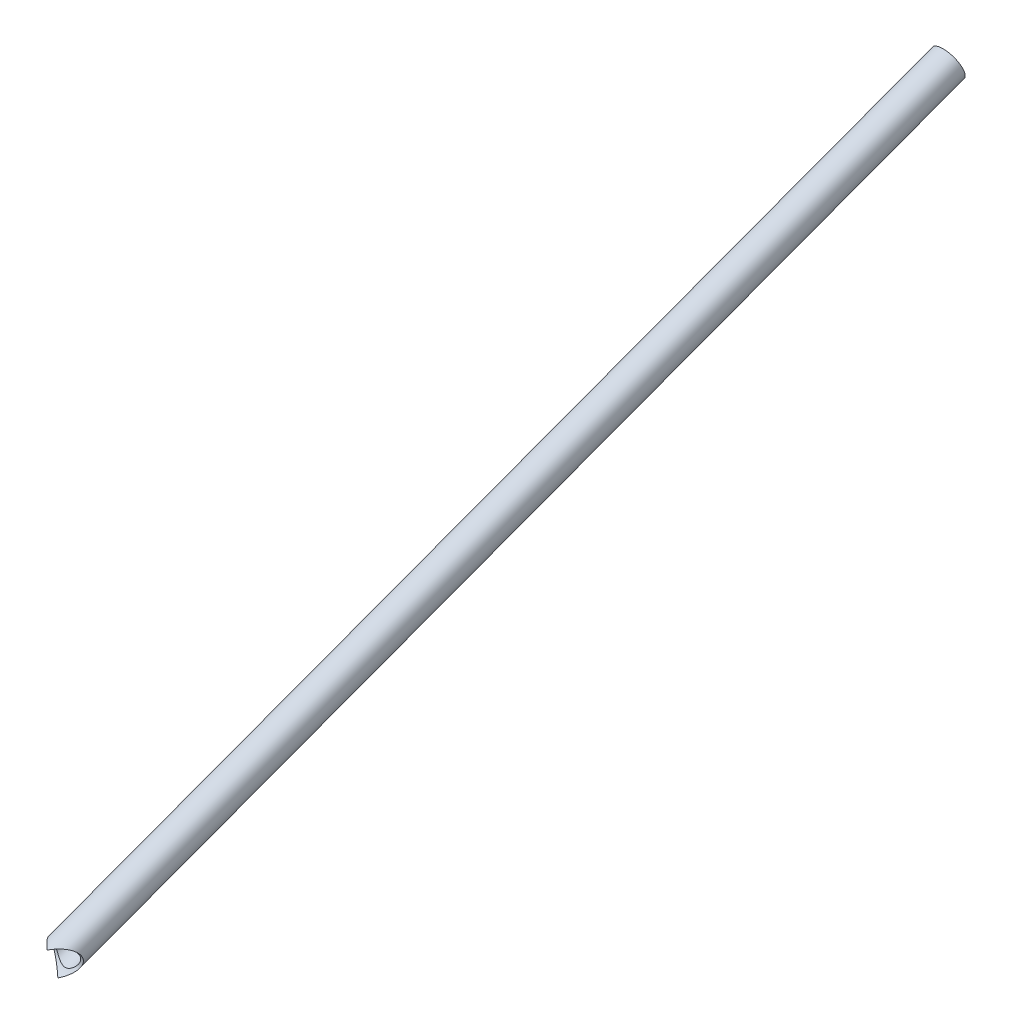
ISO-10303-21;
HEADER;
FILE_DESCRIPTION(('STEP AP214'),'2;1');
FILE_NAME('part.step','',(''),(''),'','','');
FILE_SCHEMA(('AUTOMOTIVE_DESIGN { 1 0 10303 214 1 1 1 1 }'));
ENDSEC;
DATA;
#1=APPLICATION_CONTEXT('core data for automotive mechanical design processes');
#2=APPLICATION_PROTOCOL_DEFINITION('international standard','automotive_design',2000,#1);
#3=PRODUCT_CONTEXT('',#1,'mechanical');
#4=PRODUCT('Part','Part','',(#3));
#5=PRODUCT_RELATED_PRODUCT_CATEGORY('part','',(#4));
#6=PRODUCT_DEFINITION_FORMATION('','',#4);
#7=PRODUCT_DEFINITION_CONTEXT('part definition',#1,'design');
#8=PRODUCT_DEFINITION('design','',#6,#7);
#9=PRODUCT_DEFINITION_SHAPE('','',#8);
#10=(LENGTH_UNIT() NAMED_UNIT(*) SI_UNIT(.MILLI.,.METRE.));
#11=(NAMED_UNIT(*) PLANE_ANGLE_UNIT() SI_UNIT($,.RADIAN.));
#12=(NAMED_UNIT(*) SI_UNIT($,.STERADIAN.) SOLID_ANGLE_UNIT());
#13=UNCERTAINTY_MEASURE_WITH_UNIT(LENGTH_MEASURE(1.E-05),#10,'distance_accuracy_value','');
#14=(GEOMETRIC_REPRESENTATION_CONTEXT(3) GLOBAL_UNCERTAINTY_ASSIGNED_CONTEXT((#13)) GLOBAL_UNIT_ASSIGNED_CONTEXT((#10,
#11,#12)) REPRESENTATION_CONTEXT('',''));
#15=CARTESIAN_POINT('',(0.,0.,0.));
#16=DIRECTION('',(0.,0.,1.));
#17=DIRECTION('',(1.,0.,0.));
#18=AXIS2_PLACEMENT_3D('',#15,#16,#17);
#19=CARTESIAN_POINT('',(0.,380.,-601.037933611912));
#20=DIRECTION('',(0.,0.347902326560255,-0.937530784120693));
#21=DIRECTION('',(0.,0.937530784120693,0.347902326560255));
#22=AXIS2_PLACEMENT_3D('',#19,#20,#21);
#23=CYLINDRICAL_SURFACE('',#22,7.9);
#24=CARTESIAN_POINT('',(0.,580.,-1140.));
#25=DIRECTION('',(0.,-0.347902326560255,0.937530784120693));
#26=DIRECTION('',(1.,0.,0.));
#27=AXIS2_PLACEMENT_3D('',#24,#25,#26);
#28=CIRCLE('',#27,7.9);
#29=CARTESIAN_POINT('',(7.90000000000003,580.,-1140.));
#30=VERTEX_POINT('',#29);
#31=EDGE_CURVE('E80',#30,#30,#28,.T.);
#32=ORIENTED_EDGE('',*,*,#31,.F.);
#33=EDGE_LOOP('',(#32));
#34=FACE_BOUND('',#33,.T.);
#35=CARTESIAN_POINT('',(0.,389.242151943482,-603.236257394615));
#36=CARTESIAN_POINT('',(-0.140198705166121,389.242151977319,-603.236255241536));
#37=CARTESIAN_POINT('',(-0.280388340726437,389.240597887288,-603.242821402192));
#38=CARTESIAN_POINT('',(-0.559491933208393,389.234372373076,-603.26875026409));
#39=CARTESIAN_POINT('',(-0.698405940657546,389.22970107291,-603.288112456248));
#40=CARTESIAN_POINT('',(-0.974231980117167,389.21719582959,-603.338798014634));
#41=CARTESIAN_POINT('',(-1.11113798186807,389.20935382668,-603.370151851908));
#42=CARTESIAN_POINT('',(-1.38184415750909,389.190454753618,-603.443546544515));
#43=CARTESIAN_POINT('',(-1.51564313820158,389.179396469658,-603.485591433842));
#44=CARTESIAN_POINT('',(-1.83055904233548,389.149091490291,-603.596958444708));
#45=CARTESIAN_POINT('',(-2.01002233988592,389.128331602233,-603.670546643312));
#46=CARTESIAN_POINT('',(-2.36153905933223,389.08025165378,-603.83187527095));
#47=CARTESIAN_POINT('',(-2.53358898873314,389.052928540402,-603.919622279912));
#48=CARTESIAN_POINT('',(-2.87071277700848,388.991350132656,-604.106371599609));
#49=CARTESIAN_POINT('',(-3.03576783451181,388.957077430925,-604.205401894357));
#50=CARTESIAN_POINT('',(-3.35865952772207,388.881316816409,-604.412001134054));
#51=CARTESIAN_POINT('',(-3.51649641276468,388.839829153088,-604.519569783713));
#52=CARTESIAN_POINT('',(-3.89326619557402,388.729325803536,-604.790075551307));
#53=CARTESIAN_POINT('',(-4.10849126450112,388.656233595525,-604.956532907588));
#54=CARTESIAN_POINT('',(-4.52507639374603,388.493189654576,-605.298410199623));
#55=CARTESIAN_POINT('',(-4.72643053660201,388.403230786334,-605.47383390559));
#56=CARTESIAN_POINT('',(-5.11493700864667,388.20540926072,-605.829875742051));
#57=CARTESIAN_POINT('',(-5.30210118205765,388.097561779951,-606.010489362965));
#58=CARTESIAN_POINT('',(-5.66167374437898,387.862818604761,-606.373930522913));
#59=CARTESIAN_POINT('',(-5.83408766897075,387.735930105996,-606.556757201734));
#60=CARTESIAN_POINT('',(-6.12818251694024,387.491029518737,-606.88317689917));
#61=CARTESIAN_POINT('',(-6.25288575762632,387.376806480837,-607.02689774714));
#62=CARTESIAN_POINT('',(-6.49148732020408,387.135481755064,-607.312471837915));
#63=CARTESIAN_POINT('',(-6.6053878405528,387.008382698519,-607.454325455637));
#64=CARTESIAN_POINT('',(-6.82121925179067,386.74120079806,-607.734472554201));
#65=CARTESIAN_POINT('',(-6.92316492074693,386.601134375641,-607.872770261922));
#66=CARTESIAN_POINT('',(-7.11403361083095,386.307851457572,-608.144333806831));
#67=CARTESIAN_POINT('',(-7.20295898327907,386.154637344194,-608.27760054932));
#68=CARTESIAN_POINT('',(-7.35239681898779,385.862843871525,-608.51497135532));
#69=CARTESIAN_POINT('',(-7.41516511272455,385.726287342035,-608.620145626029));
#70=CARTESIAN_POINT('',(-7.53012562345861,385.4447284742,-608.824794622522));
#71=CARTESIAN_POINT('',(-7.58231997250971,385.299727846068,-608.924270494382));
#72=CARTESIAN_POINT('',(-7.67540791728613,385.00188657388,-609.116456276562));
#73=CARTESIAN_POINT('',(-7.71630532585939,384.84904859572,-609.20916846191));
#74=CARTESIAN_POINT('',(-7.78619269743312,384.536292956981,-609.386849001519));
#75=CARTESIAN_POINT('',(-7.815182523126,384.376375214787,-609.471817266474));
#76=CARTESIAN_POINT('',(-7.86086179509573,384.049814247314,-609.633416701403));
#77=CARTESIAN_POINT('',(-7.87749895930504,383.883145549159,-609.710011278019));
#78=CARTESIAN_POINT('',(-7.89797323859594,383.544972331301,-609.853653541672));
#79=CARTESIAN_POINT('',(-7.90181032698043,383.373467801512,-609.920701208797));
#80=CARTESIAN_POINT('',(-7.89661408320679,383.027031101979,-610.044649344261));
#81=CARTESIAN_POINT('',(-7.88758124894791,382.852099065093,-610.101550205054));
#82=CARTESIAN_POINT('',(-7.85681088207579,382.500271616033,-610.204844386127));
#83=CARTESIAN_POINT('',(-7.83507377871527,382.323376270394,-610.251238061351));
#84=CARTESIAN_POINT('',(-7.78114606022269,381.980922367413,-610.330659510985));
#85=CARTESIAN_POINT('',(-7.74975082382363,381.815395943092,-610.36437315506));
#86=CARTESIAN_POINT('',(-7.67667179046077,381.484954795945,-610.422658784068));
#87=CARTESIAN_POINT('',(-7.63498452249844,381.320040298576,-610.4472276779));
#88=CARTESIAN_POINT('',(-7.54188327999767,380.99192930351,-610.487451718505));
#89=CARTESIAN_POINT('',(-7.49047131361974,380.828732458448,-610.503108702925));
#90=CARTESIAN_POINT('',(-7.37849967418177,380.504850923176,-610.525899563326));
#91=CARTESIAN_POINT('',(-7.31793649158179,380.344167222973,-610.533030159999));
#92=CARTESIAN_POINT('',(-7.18271553524361,380.012436719456,-610.539495163796));
#93=CARTESIAN_POINT('',(-7.10729357629139,379.841686991683,-610.538106420397));
#94=CARTESIAN_POINT('',(-6.94718292382073,379.504885174552,-610.526521481653));
#95=CARTESIAN_POINT('',(-6.86249100159554,379.338834747456,-610.516322209042));
#96=CARTESIAN_POINT('',(-6.59559781102712,378.848719215698,-610.473606953503));
#97=CARTESIAN_POINT('',(-6.4005145164629,378.53253335657,-610.428975267046));
#98=CARTESIAN_POINT('',(-6.06437493065114,378.045936409469,-610.336672798002));
#99=CARTESIAN_POINT('',(-5.93249725847833,377.867361866003,-610.297197249977));
#100=CARTESIAN_POINT('',(-5.65883825862758,377.519985429689,-610.210257942293));
#101=CARTESIAN_POINT('',(-5.51705776702679,377.35118271402,-610.16279485653));
#102=CARTESIAN_POINT('',(-5.2239397646556,377.023693934682,-610.061295075608));
#103=CARTESIAN_POINT('',(-5.07258685943895,376.865025036397,-610.007247655189));
#104=CARTESIAN_POINT('',(-4.76085707943454,376.55870712518,-609.89423880951));
#105=CARTESIAN_POINT('',(-4.60048081212744,376.411057371957,-609.835277714925));
#106=CARTESIAN_POINT('',(-4.26879305155555,376.125803328825,-609.713470068796));
#107=CARTESIAN_POINT('',(-4.0973733489494,375.988341001071,-609.650585353993));
#108=CARTESIAN_POINT('',(-3.74516170717425,375.726441739216,-609.523678723717));
#109=CARTESIAN_POINT('',(-3.56436747522854,375.602008014268,-609.459656532586));
#110=CARTESIAN_POINT('',(-3.19337181317161,375.367840521572,-609.33315911564));
#111=CARTESIAN_POINT('',(-3.00318690795784,375.25808210903,-609.27068144366));
#112=CARTESIAN_POINT('',(-2.61290530262883,375.055141826641,-609.15041045074));
#113=CARTESIAN_POINT('',(-2.41281528580746,374.961948969249,-609.092614038784));
#114=CARTESIAN_POINT('',(-1.95639898131723,374.776166469794,-608.973694700909));
#115=CARTESIAN_POINT('',(-1.69747434733721,374.688335585646,-608.914698718307));
#116=CARTESIAN_POINT('',(-1.29944939706585,374.58327810528,-608.842479579774));
#117=CARTESIAN_POINT('',(-1.16526918497803,374.552719636604,-608.821128635475));
#118=CARTESIAN_POINT('',(-0.894241109356835,374.501257701402,-608.784857322806));
#119=CARTESIAN_POINT('',(-0.757394675082577,374.480349202666,-608.769933603076));
#120=CARTESIAN_POINT('',(-0.480501039362896,374.448689239913,-608.747235715174));
#121=CARTESIAN_POINT('',(-0.34043542035164,374.438043741498,-608.739536157871));
#122=CARTESIAN_POINT('',(-0.0596888859674242,374.427676204355,-608.732038510629));
#123=CARTESIAN_POINT('',(0.0809919953121941,374.427953567841,-608.732239988281));
#124=CARTESIAN_POINT('',(0.361770200254932,374.439424961367,-608.7405340413));
#125=CARTESIAN_POINT('',(0.501867020233732,374.450626998017,-608.748632404231));
#126=CARTESIAN_POINT('',(0.780185241006597,374.483544655024,-608.772215978923));
#127=CARTESIAN_POINT('',(0.918406351388022,374.505261884761,-608.787702321428));
#128=CARTESIAN_POINT('',(1.21487363601653,374.562950671167,-608.828308148445));
#129=CARTESIAN_POINT('',(1.37261154579287,374.600696385801,-608.854604059468));
#130=CARTESIAN_POINT('',(1.68339925929204,374.688206151154,-608.914331415713));
#131=CARTESIAN_POINT('',(1.83644528097915,374.737979624322,-608.947768452836));
#132=CARTESIAN_POINT('',(2.13771707801457,374.848311986738,-609.020067735951));
#133=CARTESIAN_POINT('',(2.28592904549355,374.908899032025,-609.058944086137));
#134=CARTESIAN_POINT('',(2.57697398913325,375.039543768504,-609.140390440869));
#135=CARTESIAN_POINT('',(2.71980824673272,375.10959918501,-609.182959557387));
#136=CARTESIAN_POINT('',(3.08204037383439,375.30153935742,-609.295840933719));
#137=CARTESIAN_POINT('',(3.29752530331904,375.429828977798,-609.367858250044));
#138=CARTESIAN_POINT('',(3.71607497426017,375.704815617507,-609.512933061847));
#139=CARTESIAN_POINT('',(3.91913278510178,375.851522771637,-609.585991110242));
#140=CARTESIAN_POINT('',(4.31346966621373,376.161593492499,-609.729646653146));
#141=CARTESIAN_POINT('',(4.50473340408795,376.324978037019,-609.800240895039));
#142=CARTESIAN_POINT('',(4.87523576964829,376.666876911588,-609.935918029154));
#143=CARTESIAN_POINT('',(5.054476756547,376.84538825767,-610.001002003311));
#144=CARTESIAN_POINT('',(5.40715910714237,377.223571868336,-610.125428106818));
#145=CARTESIAN_POINT('',(5.58012784480557,377.423787874468,-610.184461691772));
#146=CARTESIAN_POINT('',(5.91194645909255,377.838529507845,-610.291252363501));
#147=CARTESIAN_POINT('',(6.07079392191951,378.05305757057,-610.339007524719));
#148=CARTESIAN_POINT('',(6.37260703914607,378.494790318176,-610.420613232704));
#149=CARTESIAN_POINT('',(6.51560987386382,378.721963362573,-610.454496856426));
#150=CARTESIAN_POINT('',(6.78432413306613,379.188043865959,-610.506071325269));
#151=CARTESIAN_POINT('',(6.91004381567756,379.426945646221,-610.523769926825));
#152=CARTESIAN_POINT('',(7.10741180804397,379.841807788228,-610.538159523567));
#153=CARTESIAN_POINT('',(7.18399982577256,380.015274451949,-610.539543651966));
#154=CARTESIAN_POINT('',(7.32679366399501,380.36621910134,-610.532493256282));
#155=CARTESIAN_POINT('',(7.39300216803346,380.543696036561,-610.524061274846));
#156=CARTESIAN_POINT('',(7.51418711651113,380.901580748943,-610.496757123999));
#157=CARTESIAN_POINT('',(7.569168812689,381.081987112926,-610.477889851455));
#158=CARTESIAN_POINT('',(7.66714123466579,381.444600742345,-610.42923738888));
#159=CARTESIAN_POINT('',(7.71013165615638,381.626808053364,-610.399451921816));
#160=CARTESIAN_POINT('',(7.78363892935904,381.992738876407,-610.328462944447));
#161=CARTESIAN_POINT('',(7.81407756665059,382.17646482843,-610.287190445173));
#162=CARTESIAN_POINT('',(7.8615460161556,382.54274951111,-610.19326903215));
#163=CARTESIAN_POINT('',(7.87857584876237,382.725308243541,-610.140620135705));
#164=CARTESIAN_POINT('',(7.89889629122489,383.087579024159,-610.02420343243));
#165=CARTESIAN_POINT('',(7.90219021289688,383.267291748126,-609.960438309658));
#166=CARTESIAN_POINT('',(7.89498147442727,383.622302121153,-609.822306005207));
#167=CARTESIAN_POINT('',(7.88447974020792,383.797600065715,-609.747939535358));
#168=CARTESIAN_POINT('',(7.85152035750266,384.126065665855,-609.59685460844));
#169=CARTESIAN_POINT('',(7.83028096818354,384.279763382611,-609.5210162287));
#170=CARTESIAN_POINT('',(7.77697505394905,384.581423294619,-609.361973612441));
#171=CARTESIAN_POINT('',(7.74490488001,384.729383538093,-609.278766900421));
#172=CARTESIAN_POINT('',(7.67041072764318,385.018683712275,-609.105845979824));
#173=CARTESIAN_POINT('',(7.62798923978146,385.16002522574,-609.016133340243));
#174=CARTESIAN_POINT('',(7.5333322084778,385.435572741072,-608.831014863111));
#175=CARTESIAN_POINT('',(7.48109296045794,385.569776024835,-608.735606885819));
#176=CARTESIAN_POINT('',(7.36477238200519,385.836647445945,-608.535442481984));
#177=CARTESIAN_POINT('',(7.30025295815971,385.968953232687,-608.430457622124));
#178=CARTESIAN_POINT('',(7.16186299031128,386.224963946371,-608.216215477236));
#179=CARTESIAN_POINT('',(7.08798878828719,386.348665479296,-608.106956532516));
#180=CARTESIAN_POINT('',(6.85342018659249,386.706572101107,-607.774239172092));
#181=CARTESIAN_POINT('',(6.67970134284612,386.927755549084,-607.545705885714));
#182=CARTESIAN_POINT('',(6.35307996166259,387.281093054218,-607.144249939501));
#183=CARTESIAN_POINT('',(6.20692698135833,387.421280854876,-606.972700388535));
#184=CARTESIAN_POINT('',(5.90018918722438,387.683797385549,-606.62864345489));
#185=CARTESIAN_POINT('',(5.73959862377018,387.80611894916,-606.45613571651));
#186=CARTESIAN_POINT('',(5.40452485119764,388.034078053739,-606.112021997577));
#187=CARTESIAN_POINT('',(5.22998849476687,388.13964669664,-605.940422410662));
#188=CARTESIAN_POINT('',(4.86828371349041,388.334447788917,-605.601394891791));
#189=CARTESIAN_POINT('',(4.68111730010876,388.423682831219,-605.43396630135));
#190=CARTESIAN_POINT('',(4.29088393944367,388.588258309468,-605.103216937552));
#191=CARTESIAN_POINT('',(4.08759285149929,388.663322384135,-604.940022782266));
#192=CARTESIAN_POINT('',(3.66772388143012,388.798589572024,-604.624611417357));
#193=CARTESIAN_POINT('',(3.45113915551875,388.858784949105,-604.472399951029));
#194=CARTESIAN_POINT('',(3.00519187899075,388.964975098142,-604.184772497669));
#195=CARTESIAN_POINT('',(2.77589368201285,389.01103483517,-604.04928143923));
#196=CARTESIAN_POINT('',(2.30312557508752,389.090157119693,-603.80125892149));
#197=CARTESIAN_POINT('',(2.05967546604952,389.123237348006,-603.688696330079));
#198=CARTESIAN_POINT('',(1.66540010195306,389.16572019671,-603.536520212398));
#199=CARTESIAN_POINT('',(1.5191200046991,389.179213103398,-603.486222552019));
#200=CARTESIAN_POINT('',(1.22256884013625,389.202255549012,-603.398138219855));
#201=CARTESIAN_POINT('',(1.07230014317822,389.211807376574,-603.360344289525));
#202=CARTESIAN_POINT('',(0.76919262545116,389.227022762931,-603.299139739574));
#203=CARTESIAN_POINT('',(0.616364889895395,389.232700075562,-603.275678273704));
#204=CARTESIAN_POINT('',(0.309020942180092,389.240264388299,-603.244239345233));
#205=CARTESIAN_POINT('',(0.154504963580194,389.242151906192,-603.2362597674));
#206=CARTESIAN_POINT('',(0.,389.242151943482,-603.236257394615));
#207=B_SPLINE_CURVE_WITH_KNOTS('',3,(#35,#36,#37,#38,#39,#40,#41,#42,#43,#44,#45,#46,#47,#48,
#49,#50,#51,#52,#53,#54,#55,#56,#57,#58,#59,#60,#61,#62,#63,#64,#65,#66,#67,#68,#69,#70,#71,#72,
#73,#74,#75,#76,#77,#78,#79,#80,#81,#82,#83,#84,#85,#86,#87,#88,#89,#90,#91,#92,#93,#94,#95,#96,
#97,#98,#99,#100,#101,#102,#103,#104,#105,#106,#107,#108,#109,#110,#111,#112,#113,#114,#115,
#116,#117,#118,#119,#120,#121,#122,#123,#124,#125,#126,#127,#128,#129,#130,#131,#132,#133,#134,
#135,#136,#137,#138,#139,#140,#141,#142,#143,#144,#145,#146,#147,#148,#149,#150,#151,#152,#153,
#154,#155,#156,#157,#158,#159,#160,#161,#162,#163,#164,#165,#166,#167,#168,#169,#170,#171,#172,
#173,#174,#175,#176,#177,#178,#179,#180,#181,#182,#183,#184,#185,#186,#187,#188,#189,#190,#191,
#192,#193,#194,#195,#196,#197,#198,#199,#200,#201,#202,#203,#204,#205,#206),.UNSPECIFIED.,.T.,
.F.,(4,2,2,2,2,2,2,2,2,2,2,2,2,2,2,2,2,2,2,2,2,2,2,2,2,2,2,2,2,2,2,2,2,2,2,2,2,2,2,2,2,2,2,2,2,
2,2,2,2,2,2,2,2,2,2,2,2,2,2,2,2,2,2,2,2,2,2,2,2,2,2,2,2,2,2,2,2,2,2,2,2,2,2,2,2,4),(0.,
0.420422644221056,0.840828563078355,1.26230991769988,1.68395054407761,2.26821508807262,
2.85275193954755,3.43877144102909,4.0247706844597,4.86885683853879,5.71330088550019,
6.55703214106844,7.40044534735725,8.06565744961562,8.73073388304452,9.39497931244491,
10.0591046381852,10.6088727928331,11.1585299856325,11.7080014354712,12.2574792211449,
12.8092695921968,13.3610611141166,13.9128312894339,14.4645828225805,14.9794737194554,
15.4945385016054,16.0094970382206,16.5246535677706,17.0841101518651,17.6437622172097,
18.7625627868244,19.4385285136323,20.1144372386998,20.7914620581089,21.4684413525233,
22.1535521208675,22.8388312479635,23.522944705475,24.2066026995063,25.0425518298787,
25.4599196083725,25.8770694936669,26.2984817383095,26.7198709199797,27.1415691668036,
27.5633319761012,28.0554904591206,28.5480357522369,29.0418827430847,29.5356113020349,
30.3171931183422,31.0992069242549,31.8822168060319,32.6650725863146,33.4774106789974,
34.2898873614276,35.1004152315533,35.9105544642001,36.478917723322,37.0471337932252,
37.6150834478263,38.1830475142476,38.7544991412866,39.3259498992093,39.8972628687196,
40.4685374954086,40.9860462913751,41.503729616605,42.0212885078356,42.5390430853353,
43.0809022422466,43.6229739417354,44.7064183002558,45.5017414619471,46.2973827682131,
47.0962158658936,47.8949220402366,48.7078809235215,49.521261900278,50.330846711338,
51.1393248368772,51.6046420087095,52.0696885831413,52.533075616406,52.9963993343868),.UNSPECIFIED.);
#208=CARTESIAN_POINT('',(0.,389.242151943482,-603.236257394615));
#209=VERTEX_POINT('',#208);
#210=EDGE_CURVE('E83',#209,#209,#207,.T.);
#211=ORIENTED_EDGE('',*,*,#210,.T.);
#212=EDGE_LOOP('',(#211));
#213=FACE_BOUND('',#212,.T.);
#214=ADVANCED_FACE('F41',(#34,#213),#23,.F.);
#215=CARTESIAN_POINT('',(0.,580.,-1140.));
#216=DIRECTION('',(0.,-0.347902326560255,0.937530784120693));
#217=DIRECTION('',(1.,0.,0.));
#218=AXIS2_PLACEMENT_3D('',#215,#216,#217);
#219=PLANE('',#218);
#220=ORIENTED_EDGE('',*,*,#31,.T.);
#221=EDGE_LOOP('',(#220));
#222=FACE_BOUND('',#221,.T.);
#223=CARTESIAN_POINT('',(0.,580.,-1140.));
#224=DIRECTION('',(0.,-0.347902326560255,0.937530784120693));
#225=DIRECTION('',(1.,0.,0.));
#226=AXIS2_PLACEMENT_3D('',#223,#224,#225);
#227=CIRCLE('',#226,9.5);
#228=CARTESIAN_POINT('',(9.50000000000003,580.,-1140.));
#229=VERTEX_POINT('',#228);
#230=EDGE_CURVE('E57',#229,#229,#227,.T.);
#231=ORIENTED_EDGE('',*,*,#230,.F.);
#232=EDGE_LOOP('',(#231));
#233=FACE_BOUND('',#232,.T.);
#234=ADVANCED_FACE('F60',(#222,#233),#219,.F.);
#235=CARTESIAN_POINT('',(0.,380.,-601.037933611912));
#236=DIRECTION('',(0.,0.347902326560255,-0.937530784120693));
#237=DIRECTION('',(0.,0.937530784120693,0.347902326560255));
#238=AXIS2_PLACEMENT_3D('',#235,#236,#237);
#239=CYLINDRICAL_SURFACE('',#238,9.5);
#240=ORIENTED_EDGE('',*,*,#230,.T.);
#241=EDGE_LOOP('',(#240));
#242=FACE_BOUND('',#241,.T.);
#243=CARTESIAN_POINT('',(0.,380.,-601.037933611912));
#244=DIRECTION('',(-0.707106781186547,0.246004094301333,-0.662934375022883));
#245=DIRECTION('',(0.707106781186547,0.246004094301333,-0.662934375022883));
#246=AXIS2_PLACEMENT_3D('',#243,#244,#245);
#247=ELLIPSE('',#246,13.4350288425444,9.5);
#248=CARTESIAN_POINT('',(0.,371.093457550853,-604.343005714235));
#249=VERTEX_POINT('',#248);
#250=CARTESIAN_POINT('',(0.,388.906542449147,-597.73286150959));
#251=VERTEX_POINT('',#250);
#252=EDGE_CURVE('E11',#249,#251,#247,.F.);
#253=ORIENTED_EDGE('',*,*,#252,.F.);
#254=CARTESIAN_POINT('',(0.,380.,-601.037933611912));
#255=DIRECTION('',(0.707106781186547,0.246004094301333,-0.662934375022883));
#256=DIRECTION('',(-0.707106781186547,0.246004094301333,-0.662934375022883));
#257=AXIS2_PLACEMENT_3D('',#254,#255,#256);
#258=ELLIPSE('',#257,13.4350288425444,9.5);
#259=EDGE_CURVE('E49',#251,#249,#258,.F.);
#260=ORIENTED_EDGE('',*,*,#259,.F.);
#261=EDGE_LOOP('',(#253,#260));
#262=FACE_BOUND('',#261,.T.);
#263=ADVANCED_FACE('F58',(#242,#262),#239,.T.);
#264=CARTESIAN_POINT('',(80.,380.,-601.037933611912));
#265=DIRECTION('',(-1.,0.,0.));
#266=DIRECTION('',(0.,0.,1.));
#267=AXIS2_PLACEMENT_3D('',#264,#265,#266);
#268=CYLINDRICAL_SURFACE('',#267,9.5);
#269=ORIENTED_EDGE('',*,*,#210,.F.);
#270=EDGE_LOOP('',(#269));
#271=FACE_BOUND('',#270,.T.);
#272=ORIENTED_EDGE('',*,*,#252,.T.);
#273=ORIENTED_EDGE('',*,*,#259,.T.);
#274=EDGE_LOOP('',(#272,#273));
#275=FACE_BOUND('',#274,.T.);
#276=ADVANCED_FACE('F55',(#271,#275),#268,.F.);
#277=CLOSED_SHELL('',(#214,#234,#263,#276));
#278=MANIFOLD_SOLID_BREP('B2',#277);
#279=ADVANCED_BREP_SHAPE_REPRESENTATION('',(#18,#278),#14);
#280=SHAPE_DEFINITION_REPRESENTATION(#9,#279);
ENDSEC;
END-ISO-10303-21;
